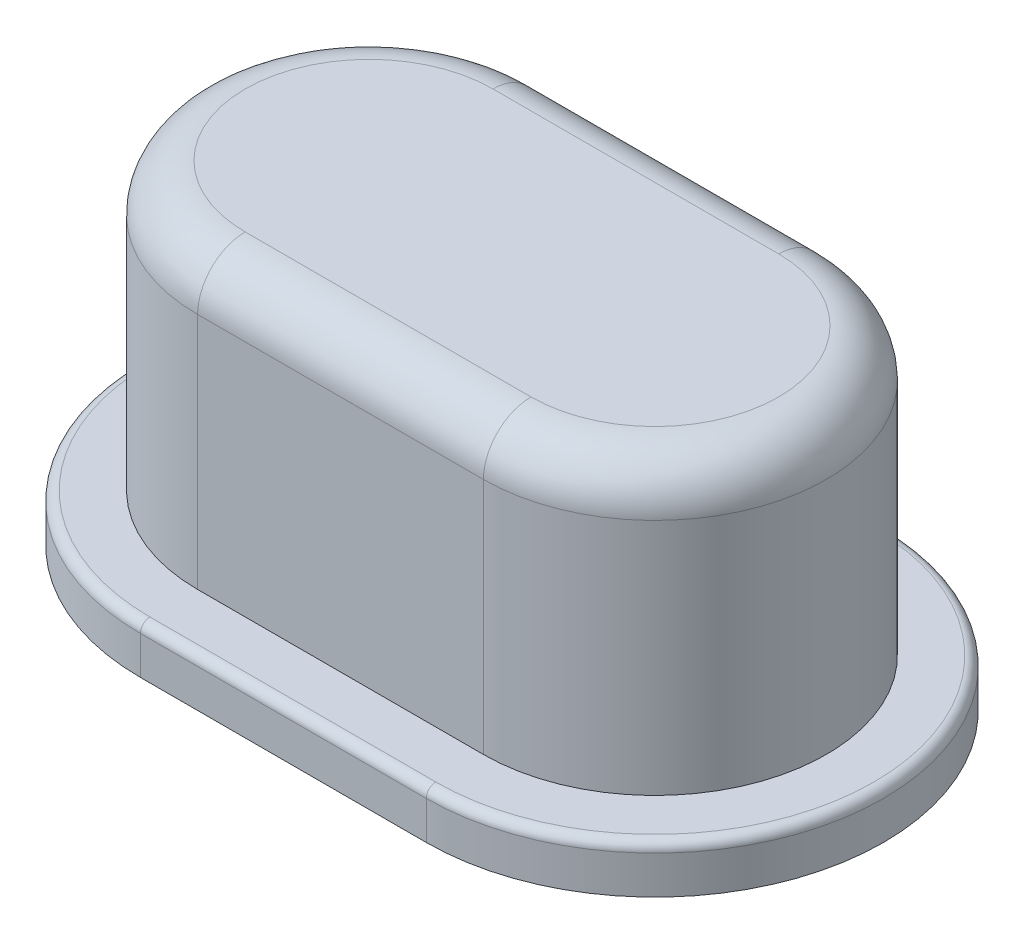
ISO-10303-21;
HEADER;
FILE_DESCRIPTION(('STEP AP214'),'2;1');
FILE_NAME('part.step','',(''),(''),'','','');
FILE_SCHEMA(('AUTOMOTIVE_DESIGN { 1 0 10303 214 1 1 1 1 }'));
ENDSEC;
DATA;
#1=APPLICATION_CONTEXT('core data for automotive mechanical design processes');
#2=APPLICATION_PROTOCOL_DEFINITION('international standard','automotive_design',2000,#1);
#3=PRODUCT_CONTEXT('',#1,'mechanical');
#4=PRODUCT('Part','Part','',(#3));
#5=PRODUCT_RELATED_PRODUCT_CATEGORY('part','',(#4));
#6=PRODUCT_DEFINITION_FORMATION('','',#4);
#7=PRODUCT_DEFINITION_CONTEXT('part definition',#1,'design');
#8=PRODUCT_DEFINITION('design','',#6,#7);
#9=PRODUCT_DEFINITION_SHAPE('','',#8);
#10=(LENGTH_UNIT() NAMED_UNIT(*) SI_UNIT(.MILLI.,.METRE.));
#11=(NAMED_UNIT(*) PLANE_ANGLE_UNIT() SI_UNIT($,.RADIAN.));
#12=(NAMED_UNIT(*) SI_UNIT($,.STERADIAN.) SOLID_ANGLE_UNIT());
#13=UNCERTAINTY_MEASURE_WITH_UNIT(LENGTH_MEASURE(1.E-05),#10,'distance_accuracy_value','');
#14=(GEOMETRIC_REPRESENTATION_CONTEXT(3) GLOBAL_UNCERTAINTY_ASSIGNED_CONTEXT((#13)) GLOBAL_UNIT_ASSIGNED_CONTEXT((#10,
#11,#12)) REPRESENTATION_CONTEXT('',''));
#15=CARTESIAN_POINT('',(0.,0.,0.));
#16=DIRECTION('',(0.,0.,1.));
#17=DIRECTION('',(1.,0.,0.));
#18=AXIS2_PLACEMENT_3D('',#15,#16,#17);
#19=CARTESIAN_POINT('',(-1.5,3.,0.));
#20=DIRECTION('',(0.,-1.,0.));
#21=DIRECTION('',(0.,0.,-1.));
#22=AXIS2_PLACEMENT_3D('',#19,#20,#21);
#23=CYLINDRICAL_SURFACE('',#22,1.8);
#24=DIRECTION('',(0.,-1.,0.));
#25=VECTOR('',#24,1.);
#26=CARTESIAN_POINT('',(-1.5,3.,1.8));
#27=LINE('',#26,#25);
#28=CARTESIAN_POINT('',(-1.5,2.5,1.8));
#29=VERTEX_POINT('',#28);
#30=CARTESIAN_POINT('',(-1.5,0.,1.8));
#31=VERTEX_POINT('',#30);
#32=EDGE_CURVE('E178',#29,#31,#27,.T.);
#33=ORIENTED_EDGE('',*,*,#32,.F.);
#34=CARTESIAN_POINT('',(-1.5,2.5,0.));
#35=DIRECTION('',(0.,1.,0.));
#36=DIRECTION('',(0.,0.,1.));
#37=AXIS2_PLACEMENT_3D('',#34,#35,#36);
#38=CIRCLE('',#37,1.8);
#39=CARTESIAN_POINT('',(-1.5,2.5,-1.8));
#40=VERTEX_POINT('',#39);
#41=EDGE_CURVE('E186',#29,#40,#38,.F.);
#42=ORIENTED_EDGE('',*,*,#41,.T.);
#43=DIRECTION('',(0.,-1.,0.));
#44=VECTOR('',#43,1.);
#45=CARTESIAN_POINT('',(-1.5,3.,-1.8));
#46=LINE('',#45,#44);
#47=CARTESIAN_POINT('',(-1.5,0.,-1.8));
#48=VERTEX_POINT('',#47);
#49=EDGE_CURVE('E175',#40,#48,#46,.T.);
#50=ORIENTED_EDGE('',*,*,#49,.T.);
#51=CARTESIAN_POINT('',(-1.5,0.,0.));
#52=DIRECTION('',(0.,1.,0.));
#53=DIRECTION('',(0.,0.,1.));
#54=AXIS2_PLACEMENT_3D('',#51,#52,#53);
#55=CIRCLE('',#54,1.8);
#56=EDGE_CURVE('E153',#48,#31,#55,.T.);
#57=ORIENTED_EDGE('',*,*,#56,.T.);
#58=EDGE_LOOP('',(#33,#42,#50,#57));
#59=FACE_BOUND('',#58,.T.);
#60=ADVANCED_FACE('F41',(#59),#23,.T.);
#61=CARTESIAN_POINT('',(-1.5,3.,1.8));
#62=DIRECTION('',(0.,0.,-1.));
#63=DIRECTION('',(-1.,0.,0.));
#64=AXIS2_PLACEMENT_3D('',#61,#62,#63);
#65=PLANE('',#64);
#66=DIRECTION('',(0.,-1.,0.));
#67=VECTOR('',#66,1.);
#68=CARTESIAN_POINT('',(1.5,3.,1.8));
#69=LINE('',#68,#67);
#70=CARTESIAN_POINT('',(1.5,2.5,1.8));
#71=VERTEX_POINT('',#70);
#72=CARTESIAN_POINT('',(1.5,0.,1.8));
#73=VERTEX_POINT('',#72);
#74=EDGE_CURVE('E176',#71,#73,#69,.T.);
#75=ORIENTED_EDGE('',*,*,#74,.F.);
#76=DIRECTION('',(1.,0.,0.));
#77=VECTOR('',#76,1.);
#78=CARTESIAN_POINT('',(-1.5,2.5,1.8));
#79=LINE('',#78,#77);
#80=EDGE_CURVE('E197',#71,#29,#79,.F.);
#81=ORIENTED_EDGE('',*,*,#80,.T.);
#82=ORIENTED_EDGE('',*,*,#32,.T.);
#83=DIRECTION('',(1.,0.,0.));
#84=VECTOR('',#83,1.);
#85=CARTESIAN_POINT('',(-1.5,0.,1.8));
#86=LINE('',#85,#84);
#87=EDGE_CURVE('E158',#31,#73,#86,.T.);
#88=ORIENTED_EDGE('',*,*,#87,.T.);
#89=EDGE_LOOP('',(#75,#81,#82,#88));
#90=FACE_BOUND('',#89,.T.);
#91=ADVANCED_FACE('F262',(#90),#65,.F.);
#92=CARTESIAN_POINT('',(1.5,3.,0.));
#93=DIRECTION('',(0.,-1.,0.));
#94=DIRECTION('',(0.,0.,-1.));
#95=AXIS2_PLACEMENT_3D('',#92,#93,#94);
#96=CYLINDRICAL_SURFACE('',#95,1.8);
#97=DIRECTION('',(0.,-1.,0.));
#98=VECTOR('',#97,1.);
#99=CARTESIAN_POINT('',(1.5,3.,-1.8));
#100=LINE('',#99,#98);
#101=CARTESIAN_POINT('',(1.5,2.5,-1.8));
#102=VERTEX_POINT('',#101);
#103=CARTESIAN_POINT('',(1.5,0.,-1.8));
#104=VERTEX_POINT('',#103);
#105=EDGE_CURVE('E172',#102,#104,#100,.T.);
#106=ORIENTED_EDGE('',*,*,#105,.F.);
#107=CARTESIAN_POINT('',(1.5,2.5,0.));
#108=DIRECTION('',(0.,1.,0.));
#109=DIRECTION('',(0.,0.,1.));
#110=AXIS2_PLACEMENT_3D('',#107,#108,#109);
#111=CIRCLE('',#110,1.8);
#112=EDGE_CURVE('E191',#102,#71,#111,.F.);
#113=ORIENTED_EDGE('',*,*,#112,.T.);
#114=ORIENTED_EDGE('',*,*,#74,.T.);
#115=CARTESIAN_POINT('',(1.5,0.,0.));
#116=DIRECTION('',(0.,1.,0.));
#117=DIRECTION('',(0.,0.,-1.));
#118=AXIS2_PLACEMENT_3D('',#115,#116,#117);
#119=CIRCLE('',#118,1.8);
#120=EDGE_CURVE('E168',#73,#104,#119,.T.);
#121=ORIENTED_EDGE('',*,*,#120,.T.);
#122=EDGE_LOOP('',(#106,#113,#114,#121));
#123=FACE_BOUND('',#122,.T.);
#124=ADVANCED_FACE('F270',(#123),#96,.T.);
#125=CARTESIAN_POINT('',(-1.5,3.,-1.8));
#126=DIRECTION('',(0.,0.,1.));
#127=DIRECTION('',(1.,0.,0.));
#128=AXIS2_PLACEMENT_3D('',#125,#126,#127);
#129=PLANE('',#128);
#130=ORIENTED_EDGE('',*,*,#49,.F.);
#131=DIRECTION('',(-1.,0.,0.));
#132=VECTOR('',#131,1.);
#133=CARTESIAN_POINT('',(1.5,2.5,-1.8));
#134=LINE('',#133,#132);
#135=EDGE_CURVE('E195',#40,#102,#134,.F.);
#136=ORIENTED_EDGE('',*,*,#135,.T.);
#137=ORIENTED_EDGE('',*,*,#105,.T.);
#138=DIRECTION('',(-1.,0.,0.));
#139=VECTOR('',#138,1.);
#140=CARTESIAN_POINT('',(-1.5,0.,-1.8));
#141=LINE('',#140,#139);
#142=EDGE_CURVE('E169',#104,#48,#141,.T.);
#143=ORIENTED_EDGE('',*,*,#142,.T.);
#144=EDGE_LOOP('',(#130,#136,#137,#143));
#145=FACE_BOUND('',#144,.T.);
#146=ADVANCED_FACE('F368',(#145),#129,.F.);
#147=CARTESIAN_POINT('',(-1.5,3.,0.));
#148=DIRECTION('',(0.,1.,0.));
#149=DIRECTION('',(0.,0.,1.));
#150=AXIS2_PLACEMENT_3D('',#147,#148,#149);
#151=PLANE('',#150);
#152=DIRECTION('',(-1.,0.,0.));
#153=VECTOR('',#152,1.);
#154=CARTESIAN_POINT('',(-1.5,3.,-1.3));
#155=LINE('',#154,#153);
#156=CARTESIAN_POINT('',(1.5,3.,-1.3));
#157=VERTEX_POINT('',#156);
#158=CARTESIAN_POINT('',(-1.5,3.,-1.3));
#159=VERTEX_POINT('',#158);
#160=EDGE_CURVE('E183',#157,#159,#155,.T.);
#161=ORIENTED_EDGE('',*,*,#160,.T.);
#162=CARTESIAN_POINT('',(-1.5,3.,0.));
#163=DIRECTION('',(0.,1.,0.));
#164=DIRECTION('',(0.,0.,1.));
#165=AXIS2_PLACEMENT_3D('',#162,#163,#164);
#166=CIRCLE('',#165,1.3);
#167=CARTESIAN_POINT('',(-1.5,3.,1.3));
#168=VERTEX_POINT('',#167);
#169=EDGE_CURVE('E187',#159,#168,#166,.T.);
#170=ORIENTED_EDGE('',*,*,#169,.T.);
#171=DIRECTION('',(1.,0.,0.));
#172=VECTOR('',#171,1.);
#173=CARTESIAN_POINT('',(1.5,3.,1.3));
#174=LINE('',#173,#172);
#175=CARTESIAN_POINT('',(1.5,3.,1.3));
#176=VERTEX_POINT('',#175);
#177=EDGE_CURVE('E179',#168,#176,#174,.T.);
#178=ORIENTED_EDGE('',*,*,#177,.T.);
#179=CARTESIAN_POINT('',(1.5,3.,0.));
#180=DIRECTION('',(0.,1.,0.));
#181=DIRECTION('',(0.,0.,1.));
#182=AXIS2_PLACEMENT_3D('',#179,#180,#181);
#183=CIRCLE('',#182,1.3);
#184=EDGE_CURVE('E185',#176,#157,#183,.T.);
#185=ORIENTED_EDGE('',*,*,#184,.T.);
#186=EDGE_LOOP('',(#161,#170,#178,#185));
#187=FACE_BOUND('',#186,.T.);
#188=ADVANCED_FACE('F338',(#187),#151,.T.);
#189=CARTESIAN_POINT('',(0.,-0.5,-2.4));
#190=DIRECTION('',(0.,0.,1.));
#191=DIRECTION('',(1.,0.,0.));
#192=AXIS2_PLACEMENT_3D('',#189,#190,#191);
#193=PLANE('',#192);
#194=DIRECTION('',(0.,1.,0.));
#195=VECTOR('',#194,1.);
#196=CARTESIAN_POINT('',(-1.5,-0.5,-2.4));
#197=LINE('',#196,#195);
#198=CARTESIAN_POINT('',(-1.5,-0.5,-2.4));
#199=VERTEX_POINT('',#198);
#200=CARTESIAN_POINT('',(-1.5,-0.1,-2.4));
#201=VERTEX_POINT('',#200);
#202=EDGE_CURVE('E246',#199,#201,#197,.T.);
#203=ORIENTED_EDGE('',*,*,#202,.T.);
#204=DIRECTION('',(1.,0.,0.));
#205=VECTOR('',#204,1.);
#206=CARTESIAN_POINT('',(0.,-0.1,-2.4));
#207=LINE('',#206,#205);
#208=CARTESIAN_POINT('',(1.5,-0.1,-2.4));
#209=VERTEX_POINT('',#208);
#210=EDGE_CURVE('E151',#201,#209,#207,.T.);
#211=ORIENTED_EDGE('',*,*,#210,.T.);
#212=DIRECTION('',(0.,1.,0.));
#213=VECTOR('',#212,1.);
#214=CARTESIAN_POINT('',(1.5,-0.5,-2.4));
#215=LINE('',#214,#213);
#216=CARTESIAN_POINT('',(1.5,-0.5,-2.4));
#217=VERTEX_POINT('',#216);
#218=EDGE_CURVE('E140',#217,#209,#215,.T.);
#219=ORIENTED_EDGE('',*,*,#218,.F.);
#220=DIRECTION('',(1.,0.,0.));
#221=VECTOR('',#220,1.);
#222=CARTESIAN_POINT('',(0.,-0.5,-2.4));
#223=LINE('',#222,#221);
#224=EDGE_CURVE('E141',#199,#217,#223,.T.);
#225=ORIENTED_EDGE('',*,*,#224,.F.);
#226=EDGE_LOOP('',(#203,#211,#219,#225));
#227=FACE_BOUND('',#226,.T.);
#228=ADVANCED_FACE('F155',(#227),#193,.F.);
#229=CARTESIAN_POINT('',(1.5,-0.5,0.));
#230=DIRECTION('',(0.,1.,0.));
#231=DIRECTION('',(0.,0.,1.));
#232=AXIS2_PLACEMENT_3D('',#229,#230,#231);
#233=CYLINDRICAL_SURFACE('',#232,2.4);
#234=ORIENTED_EDGE('',*,*,#218,.T.);
#235=CARTESIAN_POINT('',(1.5,-0.1,0.));
#236=DIRECTION('',(0.,-1.,0.));
#237=DIRECTION('',(0.,0.,-1.));
#238=AXIS2_PLACEMENT_3D('',#235,#236,#237);
#239=CIRCLE('',#238,2.4);
#240=CARTESIAN_POINT('',(1.5,-0.1,2.4));
#241=VERTEX_POINT('',#240);
#242=EDGE_CURVE('E199',#209,#241,#239,.T.);
#243=ORIENTED_EDGE('',*,*,#242,.T.);
#244=DIRECTION('',(0.,1.,0.));
#245=VECTOR('',#244,1.);
#246=CARTESIAN_POINT('',(1.5,-0.5,2.4));
#247=LINE('',#246,#245);
#248=CARTESIAN_POINT('',(1.5,-0.5,2.4));
#249=VERTEX_POINT('',#248);
#250=EDGE_CURVE('E137',#249,#241,#247,.T.);
#251=ORIENTED_EDGE('',*,*,#250,.F.);
#252=CARTESIAN_POINT('',(1.5,-0.5,0.));
#253=DIRECTION('',(0.,-1.,0.));
#254=DIRECTION('',(0.,0.,-1.));
#255=AXIS2_PLACEMENT_3D('',#252,#253,#254);
#256=CIRCLE('',#255,2.4);
#257=EDGE_CURVE('E135',#217,#249,#256,.T.);
#258=ORIENTED_EDGE('',*,*,#257,.F.);
#259=EDGE_LOOP('',(#234,#243,#251,#258));
#260=FACE_BOUND('',#259,.T.);
#261=ADVANCED_FACE('F131',(#260),#233,.T.);
#262=CARTESIAN_POINT('',(0.,-0.5,2.4));
#263=DIRECTION('',(0.,0.,-1.));
#264=DIRECTION('',(-1.,0.,0.));
#265=AXIS2_PLACEMENT_3D('',#262,#263,#264);
#266=PLANE('',#265);
#267=ORIENTED_EDGE('',*,*,#250,.T.);
#268=DIRECTION('',(-1.,0.,0.));
#269=VECTOR('',#268,1.);
#270=CARTESIAN_POINT('',(0.,-0.1,2.4));
#271=LINE('',#270,#269);
#272=CARTESIAN_POINT('',(-1.5,-0.1,2.4));
#273=VERTEX_POINT('',#272);
#274=EDGE_CURVE('E11',#241,#273,#271,.T.);
#275=ORIENTED_EDGE('',*,*,#274,.T.);
#276=DIRECTION('',(0.,1.,0.));
#277=VECTOR('',#276,1.);
#278=CARTESIAN_POINT('',(-1.5,-0.5,2.4));
#279=LINE('',#278,#277);
#280=CARTESIAN_POINT('',(-1.5,-0.5,2.4));
#281=VERTEX_POINT('',#280);
#282=EDGE_CURVE('E159',#281,#273,#279,.T.);
#283=ORIENTED_EDGE('',*,*,#282,.F.);
#284=DIRECTION('',(-1.,0.,0.));
#285=VECTOR('',#284,1.);
#286=CARTESIAN_POINT('',(0.,-0.5,2.4));
#287=LINE('',#286,#285);
#288=EDGE_CURVE('E145',#249,#281,#287,.T.);
#289=ORIENTED_EDGE('',*,*,#288,.F.);
#290=EDGE_LOOP('',(#267,#275,#283,#289));
#291=FACE_BOUND('',#290,.T.);
#292=ADVANCED_FACE('F242',(#291),#266,.F.);
#293=CARTESIAN_POINT('',(-1.5,-0.5,0.));
#294=DIRECTION('',(0.,1.,0.));
#295=DIRECTION('',(0.,0.,1.));
#296=AXIS2_PLACEMENT_3D('',#293,#294,#295);
#297=CYLINDRICAL_SURFACE('',#296,2.4);
#298=ORIENTED_EDGE('',*,*,#282,.T.);
#299=CARTESIAN_POINT('',(-1.5,-0.1,0.));
#300=DIRECTION('',(0.,-1.,0.));
#301=DIRECTION('',(0.,0.,-1.));
#302=AXIS2_PLACEMENT_3D('',#299,#300,#301);
#303=CIRCLE('',#302,2.4);
#304=EDGE_CURVE('E49',#273,#201,#303,.T.);
#305=ORIENTED_EDGE('',*,*,#304,.T.);
#306=ORIENTED_EDGE('',*,*,#202,.F.);
#307=CARTESIAN_POINT('',(-1.5,-0.5,0.));
#308=DIRECTION('',(0.,-1.,0.));
#309=DIRECTION('',(0.,0.,-1.));
#310=AXIS2_PLACEMENT_3D('',#307,#308,#309);
#311=CIRCLE('',#310,2.4);
#312=EDGE_CURVE('E149',#281,#199,#311,.T.);
#313=ORIENTED_EDGE('',*,*,#312,.F.);
#314=EDGE_LOOP('',(#298,#305,#306,#313));
#315=FACE_BOUND('',#314,.T.);
#316=ADVANCED_FACE('F248',(#315),#297,.T.);
#317=CARTESIAN_POINT('',(0.,-0.5,0.));
#318=DIRECTION('',(0.,-1.,0.));
#319=DIRECTION('',(0.,0.,-1.));
#320=AXIS2_PLACEMENT_3D('',#317,#318,#319);
#321=PLANE('',#320);
#322=ORIENTED_EDGE('',*,*,#224,.T.);
#323=ORIENTED_EDGE('',*,*,#257,.T.);
#324=ORIENTED_EDGE('',*,*,#288,.T.);
#325=ORIENTED_EDGE('',*,*,#312,.T.);
#326=EDGE_LOOP('',(#322,#323,#324,#325));
#327=FACE_BOUND('',#326,.T.);
#328=ADVANCED_FACE('F147',(#327),#321,.T.);
#329=CARTESIAN_POINT('',(0.,0.,0.));
#330=DIRECTION('',(0.,-1.,0.));
#331=DIRECTION('',(0.,0.,-1.));
#332=AXIS2_PLACEMENT_3D('',#329,#330,#331);
#333=PLANE('',#332);
#334=DIRECTION('',(-1.,0.,0.));
#335=VECTOR('',#334,1.);
#336=CARTESIAN_POINT('',(0.,0.,2.3));
#337=LINE('',#336,#335);
#338=CARTESIAN_POINT('',(-1.5,0.,2.3));
#339=VERTEX_POINT('',#338);
#340=CARTESIAN_POINT('',(1.5,0.,2.3));
#341=VERTEX_POINT('',#340);
#342=EDGE_CURVE('E209',#339,#341,#337,.F.);
#343=ORIENTED_EDGE('',*,*,#342,.T.);
#344=CARTESIAN_POINT('',(1.5,0.,0.));
#345=DIRECTION('',(0.,-1.,0.));
#346=DIRECTION('',(0.,0.,-1.));
#347=AXIS2_PLACEMENT_3D('',#344,#345,#346);
#348=CIRCLE('',#347,2.3);
#349=CARTESIAN_POINT('',(1.5,0.,-2.3));
#350=VERTEX_POINT('',#349);
#351=EDGE_CURVE('E213',#341,#350,#348,.F.);
#352=ORIENTED_EDGE('',*,*,#351,.T.);
#353=DIRECTION('',(1.,0.,0.));
#354=VECTOR('',#353,1.);
#355=CARTESIAN_POINT('',(0.,0.,-2.3));
#356=LINE('',#355,#354);
#357=CARTESIAN_POINT('',(-1.5,0.,-2.3));
#358=VERTEX_POINT('',#357);
#359=EDGE_CURVE('E214',#350,#358,#356,.F.);
#360=ORIENTED_EDGE('',*,*,#359,.T.);
#361=CARTESIAN_POINT('',(-1.5,0.,0.));
#362=DIRECTION('',(0.,-1.,0.));
#363=DIRECTION('',(0.,0.,-1.));
#364=AXIS2_PLACEMENT_3D('',#361,#362,#363);
#365=CIRCLE('',#364,2.3);
#366=EDGE_CURVE('E212',#358,#339,#365,.F.);
#367=ORIENTED_EDGE('',*,*,#366,.T.);
#368=EDGE_LOOP('',(#343,#352,#360,#367));
#369=FACE_BOUND('',#368,.T.);
#370=ORIENTED_EDGE('',*,*,#56,.F.);
#371=ORIENTED_EDGE('',*,*,#142,.F.);
#372=ORIENTED_EDGE('',*,*,#120,.F.);
#373=ORIENTED_EDGE('',*,*,#87,.F.);
#374=EDGE_LOOP('',(#370,#371,#372,#373));
#375=FACE_BOUND('',#374,.T.);
#376=ADVANCED_FACE('F236',(#369,#375),#333,.F.);
#377=CARTESIAN_POINT('',(1.5,2.5,0.));
#378=DIRECTION('',(0.,1.,0.));
#379=DIRECTION('',(0.,0.,1.));
#380=AXIS2_PLACEMENT_3D('',#377,#378,#379);
#381=TOROIDAL_SURFACE('',#380,1.3,0.5);
#382=CARTESIAN_POINT('',(1.5,2.5,1.3));
#383=DIRECTION('',(-1.,0.,0.));
#384=DIRECTION('',(0.,0.,1.));
#385=AXIS2_PLACEMENT_3D('',#382,#383,#384);
#386=CIRCLE('',#385,0.5);
#387=EDGE_CURVE('E203',#71,#176,#386,.T.);
#388=ORIENTED_EDGE('',*,*,#387,.F.);
#389=ORIENTED_EDGE('',*,*,#112,.F.);
#390=CARTESIAN_POINT('',(1.5,2.5,-1.3));
#391=DIRECTION('',(-1.,0.,0.));
#392=DIRECTION('',(0.,0.,1.));
#393=AXIS2_PLACEMENT_3D('',#390,#391,#392);
#394=CIRCLE('',#393,0.5);
#395=EDGE_CURVE('E148',#157,#102,#394,.T.);
#396=ORIENTED_EDGE('',*,*,#395,.F.);
#397=ORIENTED_EDGE('',*,*,#184,.F.);
#398=EDGE_LOOP('',(#388,#389,#396,#397));
#399=FACE_BOUND('',#398,.T.);
#400=ADVANCED_FACE('F281',(#399),#381,.T.);
#401=CARTESIAN_POINT('',(-1.5,2.5,-1.3));
#402=DIRECTION('',(1.,0.,0.));
#403=DIRECTION('',(0.,0.,-1.));
#404=AXIS2_PLACEMENT_3D('',#401,#402,#403);
#405=CYLINDRICAL_SURFACE('',#404,0.5);
#406=ORIENTED_EDGE('',*,*,#395,.T.);
#407=ORIENTED_EDGE('',*,*,#135,.F.);
#408=CARTESIAN_POINT('',(-1.5,2.5,-1.3));
#409=DIRECTION('',(-1.,0.,0.));
#410=DIRECTION('',(0.,0.,1.));
#411=AXIS2_PLACEMENT_3D('',#408,#409,#410);
#412=CIRCLE('',#411,0.5);
#413=EDGE_CURVE('E201',#159,#40,#412,.T.);
#414=ORIENTED_EDGE('',*,*,#413,.F.);
#415=ORIENTED_EDGE('',*,*,#160,.F.);
#416=EDGE_LOOP('',(#406,#407,#414,#415));
#417=FACE_BOUND('',#416,.T.);
#418=ADVANCED_FACE('F278',(#417),#405,.T.);
#419=CARTESIAN_POINT('',(-1.5,2.5,1.3));
#420=DIRECTION('',(-1.,0.,0.));
#421=DIRECTION('',(0.,0.,1.));
#422=AXIS2_PLACEMENT_3D('',#419,#420,#421);
#423=CYLINDRICAL_SURFACE('',#422,0.5);
#424=ORIENTED_EDGE('',*,*,#387,.T.);
#425=ORIENTED_EDGE('',*,*,#177,.F.);
#426=CARTESIAN_POINT('',(-1.5,2.5,1.3));
#427=DIRECTION('',(-1.,0.,0.));
#428=DIRECTION('',(0.,0.,1.));
#429=AXIS2_PLACEMENT_3D('',#426,#427,#428);
#430=CIRCLE('',#429,0.5);
#431=EDGE_CURVE('E196',#29,#168,#430,.T.);
#432=ORIENTED_EDGE('',*,*,#431,.F.);
#433=ORIENTED_EDGE('',*,*,#80,.F.);
#434=EDGE_LOOP('',(#424,#425,#432,#433));
#435=FACE_BOUND('',#434,.T.);
#436=ADVANCED_FACE('F277',(#435),#423,.T.);
#437=CARTESIAN_POINT('',(-1.5,2.5,0.));
#438=DIRECTION('',(0.,1.,0.));
#439=DIRECTION('',(0.,0.,1.));
#440=AXIS2_PLACEMENT_3D('',#437,#438,#439);
#441=TOROIDAL_SURFACE('',#440,1.3,0.5);
#442=ORIENTED_EDGE('',*,*,#413,.T.);
#443=ORIENTED_EDGE('',*,*,#41,.F.);
#444=ORIENTED_EDGE('',*,*,#431,.T.);
#445=ORIENTED_EDGE('',*,*,#169,.F.);
#446=EDGE_LOOP('',(#442,#443,#444,#445));
#447=FACE_BOUND('',#446,.T.);
#448=ADVANCED_FACE('F271',(#447),#441,.T.);
#449=CARTESIAN_POINT('',(-1.5,-0.1,0.));
#450=DIRECTION('',(0.,-1.,0.));
#451=DIRECTION('',(0.,0.,-1.));
#452=AXIS2_PLACEMENT_3D('',#449,#450,#451);
#453=TOROIDAL_SURFACE('',#452,2.3,0.1);
#454=CARTESIAN_POINT('',(-1.5,-0.1,2.3));
#455=DIRECTION('',(1.,0.,0.));
#456=DIRECTION('',(0.,0.,-1.));
#457=AXIS2_PLACEMENT_3D('',#454,#455,#456);
#458=CIRCLE('',#457,0.1);
#459=EDGE_CURVE('E223',#339,#273,#458,.T.);
#460=ORIENTED_EDGE('',*,*,#459,.F.);
#461=ORIENTED_EDGE('',*,*,#366,.F.);
#462=CARTESIAN_POINT('',(-1.5,-0.1,-2.3));
#463=DIRECTION('',(1.,0.,0.));
#464=DIRECTION('',(0.,0.,-1.));
#465=AXIS2_PLACEMENT_3D('',#462,#463,#464);
#466=CIRCLE('',#465,0.1);
#467=EDGE_CURVE('E44',#201,#358,#466,.T.);
#468=ORIENTED_EDGE('',*,*,#467,.F.);
#469=ORIENTED_EDGE('',*,*,#304,.F.);
#470=EDGE_LOOP('',(#460,#461,#468,#469));
#471=FACE_BOUND('',#470,.T.);
#472=ADVANCED_FACE('F43',(#471),#453,.T.);
#473=CARTESIAN_POINT('',(0.,-0.1,-2.3));
#474=DIRECTION('',(1.,0.,0.));
#475=DIRECTION('',(0.,0.,-1.));
#476=AXIS2_PLACEMENT_3D('',#473,#474,#475);
#477=CYLINDRICAL_SURFACE('',#476,0.1);
#478=ORIENTED_EDGE('',*,*,#467,.T.);
#479=ORIENTED_EDGE('',*,*,#359,.F.);
#480=CARTESIAN_POINT('',(1.5,-0.1,-2.3));
#481=DIRECTION('',(1.,0.,0.));
#482=DIRECTION('',(0.,0.,-1.));
#483=AXIS2_PLACEMENT_3D('',#480,#481,#482);
#484=CIRCLE('',#483,0.1);
#485=EDGE_CURVE('E225',#209,#350,#484,.T.);
#486=ORIENTED_EDGE('',*,*,#485,.F.);
#487=ORIENTED_EDGE('',*,*,#210,.F.);
#488=EDGE_LOOP('',(#478,#479,#486,#487));
#489=FACE_BOUND('',#488,.T.);
#490=ADVANCED_FACE('F235',(#489),#477,.T.);
#491=CARTESIAN_POINT('',(0.,-0.1,2.3));
#492=DIRECTION('',(-1.,0.,0.));
#493=DIRECTION('',(0.,0.,1.));
#494=AXIS2_PLACEMENT_3D('',#491,#492,#493);
#495=CYLINDRICAL_SURFACE('',#494,0.1);
#496=ORIENTED_EDGE('',*,*,#459,.T.);
#497=ORIENTED_EDGE('',*,*,#274,.F.);
#498=CARTESIAN_POINT('',(1.5,-0.1,2.3));
#499=DIRECTION('',(1.,0.,0.));
#500=DIRECTION('',(0.,0.,-1.));
#501=AXIS2_PLACEMENT_3D('',#498,#499,#500);
#502=CIRCLE('',#501,0.1);
#503=EDGE_CURVE('E218',#341,#241,#502,.T.);
#504=ORIENTED_EDGE('',*,*,#503,.F.);
#505=ORIENTED_EDGE('',*,*,#342,.F.);
#506=EDGE_LOOP('',(#496,#497,#504,#505));
#507=FACE_BOUND('',#506,.T.);
#508=ADVANCED_FACE('F243',(#507),#495,.T.);
#509=CARTESIAN_POINT('',(1.5,-0.1,0.));
#510=DIRECTION('',(0.,-1.,0.));
#511=DIRECTION('',(0.,0.,-1.));
#512=AXIS2_PLACEMENT_3D('',#509,#510,#511);
#513=TOROIDAL_SURFACE('',#512,2.3,0.1);
#514=ORIENTED_EDGE('',*,*,#485,.T.);
#515=ORIENTED_EDGE('',*,*,#351,.F.);
#516=ORIENTED_EDGE('',*,*,#503,.T.);
#517=ORIENTED_EDGE('',*,*,#242,.F.);
#518=EDGE_LOOP('',(#514,#515,#516,#517));
#519=FACE_BOUND('',#518,.T.);
#520=ADVANCED_FACE('F241',(#519),#513,.T.);
#521=CLOSED_SHELL('',(#60,#91,#124,#146,#188,#228,#261,#292,#316,#328,#376,#400,#418,#436,#448,
#472,#490,#508,#520));
#522=MANIFOLD_SOLID_BREP('B2',#521);
#523=ADVANCED_BREP_SHAPE_REPRESENTATION('',(#18,#522),#14);
#524=SHAPE_DEFINITION_REPRESENTATION(#9,#523);
ENDSEC;
END-ISO-10303-21;
